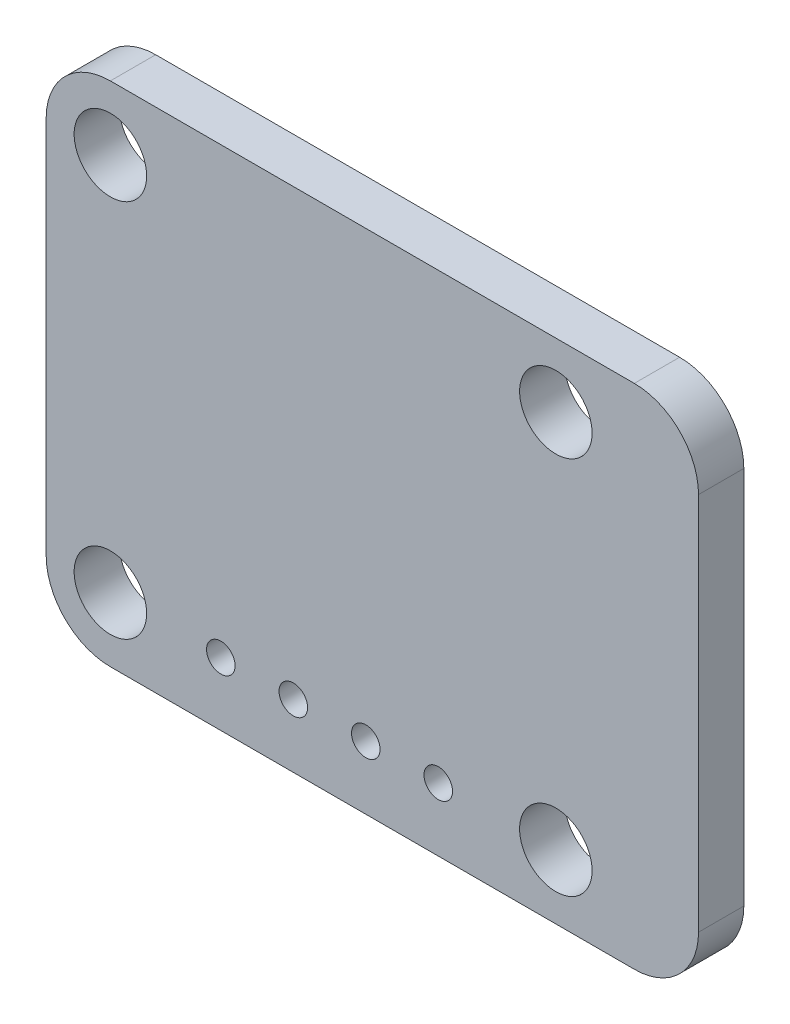
ISO-10303-21;
HEADER;
FILE_DESCRIPTION(('STEP AP214'),'2;1');
FILE_NAME('part.step','',(''),(''),'','','');
FILE_SCHEMA(('AUTOMOTIVE_DESIGN { 1 0 10303 214 1 1 1 1 }'));
ENDSEC;
DATA;
#1=APPLICATION_CONTEXT('core data for automotive mechanical design processes');
#2=APPLICATION_PROTOCOL_DEFINITION('international standard','automotive_design',2000,#1);
#3=PRODUCT_CONTEXT('',#1,'mechanical');
#4=PRODUCT('Part','Part','',(#3));
#5=PRODUCT_RELATED_PRODUCT_CATEGORY('part','',(#4));
#6=PRODUCT_DEFINITION_FORMATION('','',#4);
#7=PRODUCT_DEFINITION_CONTEXT('part definition',#1,'design');
#8=PRODUCT_DEFINITION('design','',#6,#7);
#9=PRODUCT_DEFINITION_SHAPE('','',#8);
#10=(LENGTH_UNIT() NAMED_UNIT(*) SI_UNIT(.MILLI.,.METRE.));
#11=(NAMED_UNIT(*) PLANE_ANGLE_UNIT() SI_UNIT($,.RADIAN.));
#12=(NAMED_UNIT(*) SI_UNIT($,.STERADIAN.) SOLID_ANGLE_UNIT());
#13=UNCERTAINTY_MEASURE_WITH_UNIT(LENGTH_MEASURE(1.E-05),#10,'distance_accuracy_value','');
#14=(GEOMETRIC_REPRESENTATION_CONTEXT(3) GLOBAL_UNCERTAINTY_ASSIGNED_CONTEXT((#13)) GLOBAL_UNIT_ASSIGNED_CONTEXT((#10,
#11,#12)) REPRESENTATION_CONTEXT('',''));
#15=CARTESIAN_POINT('',(0.,0.,0.));
#16=DIRECTION('',(0.,0.,1.));
#17=DIRECTION('',(1.,0.,0.));
#18=AXIS2_PLACEMENT_3D('',#15,#16,#17);
#19=CARTESIAN_POINT('',(-9.18,-6.64,1.5875));
#20=DIRECTION('',(0.,0.,-1.));
#21=DIRECTION('',(-1.,0.,0.));
#22=AXIS2_PLACEMENT_3D('',#19,#20,#21);
#23=CYLINDRICAL_SURFACE('',#22,2.25);
#24=CARTESIAN_POINT('',(-9.18,-6.64,0.));
#25=DIRECTION('',(0.,0.,1.));
#26=DIRECTION('',(-1.,0.,0.));
#27=AXIS2_PLACEMENT_3D('',#24,#25,#26);
#28=CIRCLE('',#27,2.25);
#29=CARTESIAN_POINT('',(-11.43,-6.64,0.));
#30=VERTEX_POINT('',#29);
#31=CARTESIAN_POINT('',(-9.18,-8.89,0.));
#32=VERTEX_POINT('',#31);
#33=EDGE_CURVE('E130',#30,#32,#28,.T.);
#34=ORIENTED_EDGE('',*,*,#33,.T.);
#35=DIRECTION('',(0.,0.,-1.));
#36=VECTOR('',#35,1.);
#37=CARTESIAN_POINT('',(-9.18,-8.89,1.5875));
#38=LINE('',#37,#36);
#39=CARTESIAN_POINT('',(-9.18,-8.89,1.5875));
#40=VERTEX_POINT('',#39);
#41=EDGE_CURVE('E11',#40,#32,#38,.T.);
#42=ORIENTED_EDGE('',*,*,#41,.F.);
#43=CARTESIAN_POINT('',(-9.18,-6.64,1.5875));
#44=DIRECTION('',(0.,0.,1.));
#45=DIRECTION('',(-1.,0.,0.));
#46=AXIS2_PLACEMENT_3D('',#43,#44,#45);
#47=CIRCLE('',#46,2.25);
#48=CARTESIAN_POINT('',(-11.43,-6.64,1.5875));
#49=VERTEX_POINT('',#48);
#50=EDGE_CURVE('E145',#49,#40,#47,.T.);
#51=ORIENTED_EDGE('',*,*,#50,.F.);
#52=DIRECTION('',(0.,0.,-1.));
#53=VECTOR('',#52,1.);
#54=CARTESIAN_POINT('',(-11.43,-6.64,1.5875));
#55=LINE('',#54,#53);
#56=EDGE_CURVE('E126',#49,#30,#55,.T.);
#57=ORIENTED_EDGE('',*,*,#56,.T.);
#58=EDGE_LOOP('',(#34,#42,#51,#57));
#59=FACE_BOUND('',#58,.T.);
#60=ADVANCED_FACE('F34',(#59),#23,.T.);
#61=CARTESIAN_POINT('',(9.18,-8.89,1.5875));
#62=DIRECTION('',(0.,1.,0.));
#63=DIRECTION('',(0.,0.,1.));
#64=AXIS2_PLACEMENT_3D('',#61,#62,#63);
#65=PLANE('',#64);
#66=DIRECTION('',(1.,0.,0.));
#67=VECTOR('',#66,1.);
#68=CARTESIAN_POINT('',(9.18,-8.89,0.));
#69=LINE('',#68,#67);
#70=CARTESIAN_POINT('',(9.18,-8.89,0.));
#71=VERTEX_POINT('',#70);
#72=EDGE_CURVE('E133',#32,#71,#69,.T.);
#73=ORIENTED_EDGE('',*,*,#72,.T.);
#74=DIRECTION('',(0.,0.,-1.));
#75=VECTOR('',#74,1.);
#76=CARTESIAN_POINT('',(9.18,-8.89,1.5875));
#77=LINE('',#76,#75);
#78=CARTESIAN_POINT('',(9.18,-8.89,1.5875));
#79=VERTEX_POINT('',#78);
#80=EDGE_CURVE('E42',#79,#71,#77,.T.);
#81=ORIENTED_EDGE('',*,*,#80,.F.);
#82=DIRECTION('',(1.,0.,0.));
#83=VECTOR('',#82,1.);
#84=CARTESIAN_POINT('',(9.18,-8.89,1.5875));
#85=LINE('',#84,#83);
#86=EDGE_CURVE('E93',#40,#79,#85,.T.);
#87=ORIENTED_EDGE('',*,*,#86,.F.);
#88=ORIENTED_EDGE('',*,*,#41,.T.);
#89=EDGE_LOOP('',(#73,#81,#87,#88));
#90=FACE_BOUND('',#89,.T.);
#91=ADVANCED_FACE('F263',(#90),#65,.F.);
#92=CARTESIAN_POINT('',(9.18,-6.64,1.5875));
#93=DIRECTION('',(0.,0.,-1.));
#94=DIRECTION('',(-1.,0.,0.));
#95=AXIS2_PLACEMENT_3D('',#92,#93,#94);
#96=CYLINDRICAL_SURFACE('',#95,2.25);
#97=CARTESIAN_POINT('',(9.18,-6.64,0.));
#98=DIRECTION('',(0.,0.,1.));
#99=DIRECTION('',(1.,0.,0.));
#100=AXIS2_PLACEMENT_3D('',#97,#98,#99);
#101=CIRCLE('',#100,2.25);
#102=CARTESIAN_POINT('',(11.43,-6.64,0.));
#103=VERTEX_POINT('',#102);
#104=EDGE_CURVE('E136',#71,#103,#101,.T.);
#105=ORIENTED_EDGE('',*,*,#104,.T.);
#106=DIRECTION('',(0.,0.,-1.));
#107=VECTOR('',#106,1.);
#108=CARTESIAN_POINT('',(11.43,-6.64,1.5875));
#109=LINE('',#108,#107);
#110=CARTESIAN_POINT('',(11.43,-6.64,1.5875));
#111=VERTEX_POINT('',#110);
#112=EDGE_CURVE('E152',#111,#103,#109,.T.);
#113=ORIENTED_EDGE('',*,*,#112,.F.);
#114=CARTESIAN_POINT('',(9.18,-6.64,1.5875));
#115=DIRECTION('',(0.,0.,1.));
#116=DIRECTION('',(1.,0.,0.));
#117=AXIS2_PLACEMENT_3D('',#114,#115,#116);
#118=CIRCLE('',#117,2.25);
#119=EDGE_CURVE('E160',#79,#111,#118,.T.);
#120=ORIENTED_EDGE('',*,*,#119,.F.);
#121=ORIENTED_EDGE('',*,*,#80,.T.);
#122=EDGE_LOOP('',(#105,#113,#120,#121));
#123=FACE_BOUND('',#122,.T.);
#124=ADVANCED_FACE('F158',(#123),#96,.T.);
#125=CARTESIAN_POINT('',(11.43,-6.64,1.5875));
#126=DIRECTION('',(-1.,0.,0.));
#127=DIRECTION('',(0.,0.,1.));
#128=AXIS2_PLACEMENT_3D('',#125,#126,#127);
#129=PLANE('',#128);
#130=DIRECTION('',(0.,1.,0.));
#131=VECTOR('',#130,1.);
#132=CARTESIAN_POINT('',(11.43,-6.64,0.));
#133=LINE('',#132,#131);
#134=CARTESIAN_POINT('',(11.43,6.64,0.));
#135=VERTEX_POINT('',#134);
#136=EDGE_CURVE('E138',#103,#135,#133,.T.);
#137=ORIENTED_EDGE('',*,*,#136,.T.);
#138=DIRECTION('',(0.,0.,-1.));
#139=VECTOR('',#138,1.);
#140=CARTESIAN_POINT('',(11.43,6.64,1.5875));
#141=LINE('',#140,#139);
#142=CARTESIAN_POINT('',(11.43,6.64,1.5875));
#143=VERTEX_POINT('',#142);
#144=EDGE_CURVE('E149',#143,#135,#141,.T.);
#145=ORIENTED_EDGE('',*,*,#144,.F.);
#146=DIRECTION('',(0.,1.,0.));
#147=VECTOR('',#146,1.);
#148=CARTESIAN_POINT('',(11.43,-6.64,1.5875));
#149=LINE('',#148,#147);
#150=EDGE_CURVE('E172',#111,#143,#149,.T.);
#151=ORIENTED_EDGE('',*,*,#150,.F.);
#152=ORIENTED_EDGE('',*,*,#112,.T.);
#153=EDGE_LOOP('',(#137,#145,#151,#152));
#154=FACE_BOUND('',#153,.T.);
#155=ADVANCED_FACE('F168',(#154),#129,.F.);
#156=CARTESIAN_POINT('',(9.18,6.64,1.5875));
#157=DIRECTION('',(0.,0.,-1.));
#158=DIRECTION('',(-1.,0.,0.));
#159=AXIS2_PLACEMENT_3D('',#156,#157,#158);
#160=CYLINDRICAL_SURFACE('',#159,2.25);
#161=CARTESIAN_POINT('',(9.18,6.64,0.));
#162=DIRECTION('',(0.,0.,1.));
#163=DIRECTION('',(1.,0.,0.));
#164=AXIS2_PLACEMENT_3D('',#161,#162,#163);
#165=CIRCLE('',#164,2.25);
#166=CARTESIAN_POINT('',(9.18,8.89,0.));
#167=VERTEX_POINT('',#166);
#168=EDGE_CURVE('E140',#135,#167,#165,.T.);
#169=ORIENTED_EDGE('',*,*,#168,.T.);
#170=DIRECTION('',(0.,0.,-1.));
#171=VECTOR('',#170,1.);
#172=CARTESIAN_POINT('',(9.18,8.89,1.5875));
#173=LINE('',#172,#171);
#174=CARTESIAN_POINT('',(9.18,8.89,1.5875));
#175=VERTEX_POINT('',#174);
#176=EDGE_CURVE('E121',#175,#167,#173,.T.);
#177=ORIENTED_EDGE('',*,*,#176,.F.);
#178=CARTESIAN_POINT('',(9.18,6.64,1.5875));
#179=DIRECTION('',(0.,0.,1.));
#180=DIRECTION('',(1.,0.,0.));
#181=AXIS2_PLACEMENT_3D('',#178,#179,#180);
#182=CIRCLE('',#181,2.25);
#183=EDGE_CURVE('E112',#143,#175,#182,.T.);
#184=ORIENTED_EDGE('',*,*,#183,.F.);
#185=ORIENTED_EDGE('',*,*,#144,.T.);
#186=EDGE_LOOP('',(#169,#177,#184,#185));
#187=FACE_BOUND('',#186,.T.);
#188=ADVANCED_FACE('F171',(#187),#160,.T.);
#189=CARTESIAN_POINT('',(9.18,8.89,1.5875));
#190=DIRECTION('',(0.,-1.,0.));
#191=DIRECTION('',(1.,0.,0.));
#192=AXIS2_PLACEMENT_3D('',#189,#190,#191);
#193=PLANE('',#192);
#194=DIRECTION('',(-1.,0.,0.));
#195=VECTOR('',#194,1.);
#196=CARTESIAN_POINT('',(9.18,8.89,0.));
#197=LINE('',#196,#195);
#198=CARTESIAN_POINT('',(-9.18,8.89,0.));
#199=VERTEX_POINT('',#198);
#200=EDGE_CURVE('E120',#167,#199,#197,.T.);
#201=ORIENTED_EDGE('',*,*,#200,.T.);
#202=DIRECTION('',(0.,0.,-1.));
#203=VECTOR('',#202,1.);
#204=CARTESIAN_POINT('',(-9.18,8.89,1.5875));
#205=LINE('',#204,#203);
#206=CARTESIAN_POINT('',(-9.18,8.89,1.5875));
#207=VERTEX_POINT('',#206);
#208=EDGE_CURVE('E117',#207,#199,#205,.T.);
#209=ORIENTED_EDGE('',*,*,#208,.F.);
#210=DIRECTION('',(-1.,0.,0.));
#211=VECTOR('',#210,1.);
#212=CARTESIAN_POINT('',(9.18,8.89,1.5875));
#213=LINE('',#212,#211);
#214=EDGE_CURVE('E106',#175,#207,#213,.T.);
#215=ORIENTED_EDGE('',*,*,#214,.F.);
#216=ORIENTED_EDGE('',*,*,#176,.T.);
#217=EDGE_LOOP('',(#201,#209,#215,#216));
#218=FACE_BOUND('',#217,.T.);
#219=ADVANCED_FACE('F118',(#218),#193,.F.);
#220=CARTESIAN_POINT('',(-9.18,6.64,1.5875));
#221=DIRECTION('',(0.,0.,-1.));
#222=DIRECTION('',(-1.,0.,0.));
#223=AXIS2_PLACEMENT_3D('',#220,#221,#222);
#224=CYLINDRICAL_SURFACE('',#223,2.25);
#225=CARTESIAN_POINT('',(-9.18,6.64,0.));
#226=DIRECTION('',(0.,0.,1.));
#227=DIRECTION('',(1.,0.,0.));
#228=AXIS2_PLACEMENT_3D('',#225,#226,#227);
#229=CIRCLE('',#228,2.25);
#230=CARTESIAN_POINT('',(-11.43,6.64,0.));
#231=VERTEX_POINT('',#230);
#232=EDGE_CURVE('E79',#199,#231,#229,.T.);
#233=ORIENTED_EDGE('',*,*,#232,.T.);
#234=DIRECTION('',(0.,0.,-1.));
#235=VECTOR('',#234,1.);
#236=CARTESIAN_POINT('',(-11.43,6.64,1.5875));
#237=LINE('',#236,#235);
#238=CARTESIAN_POINT('',(-11.43,6.64,1.5875));
#239=VERTEX_POINT('',#238);
#240=EDGE_CURVE('E122',#239,#231,#237,.T.);
#241=ORIENTED_EDGE('',*,*,#240,.F.);
#242=CARTESIAN_POINT('',(-9.18,6.64,1.5875));
#243=DIRECTION('',(0.,0.,1.));
#244=DIRECTION('',(1.,0.,0.));
#245=AXIS2_PLACEMENT_3D('',#242,#243,#244);
#246=CIRCLE('',#245,2.25);
#247=EDGE_CURVE('E110',#207,#239,#246,.T.);
#248=ORIENTED_EDGE('',*,*,#247,.F.);
#249=ORIENTED_EDGE('',*,*,#208,.T.);
#250=EDGE_LOOP('',(#233,#241,#248,#249));
#251=FACE_BOUND('',#250,.T.);
#252=ADVANCED_FACE('F124',(#251),#224,.T.);
#253=CARTESIAN_POINT('',(-11.43,-6.64,1.5875));
#254=DIRECTION('',(1.,0.,0.));
#255=DIRECTION('',(0.,1.,0.));
#256=AXIS2_PLACEMENT_3D('',#253,#254,#255);
#257=PLANE('',#256);
#258=DIRECTION('',(0.,-1.,0.));
#259=VECTOR('',#258,1.);
#260=CARTESIAN_POINT('',(-11.43,-6.64,0.));
#261=LINE('',#260,#259);
#262=EDGE_CURVE('E85',#231,#30,#261,.T.);
#263=ORIENTED_EDGE('',*,*,#262,.T.);
#264=ORIENTED_EDGE('',*,*,#56,.F.);
#265=DIRECTION('',(0.,-1.,0.));
#266=VECTOR('',#265,1.);
#267=CARTESIAN_POINT('',(-11.43,-6.64,1.5875));
#268=LINE('',#267,#266);
#269=EDGE_CURVE('E50',#239,#49,#268,.T.);
#270=ORIENTED_EDGE('',*,*,#269,.F.);
#271=ORIENTED_EDGE('',*,*,#240,.T.);
#272=EDGE_LOOP('',(#263,#264,#270,#271));
#273=FACE_BOUND('',#272,.T.);
#274=ADVANCED_FACE('F238',(#273),#257,.F.);
#275=CARTESIAN_POINT('',(-9.18,-6.64,1.5875));
#276=DIRECTION('',(0.,0.,-1.));
#277=DIRECTION('',(-1.,0.,0.));
#278=AXIS2_PLACEMENT_3D('',#275,#276,#277);
#279=PLANE('',#278);
#280=CARTESIAN_POINT('',(6.43,6.64,1.5875));
#281=DIRECTION('',(0.,0.,1.));
#282=DIRECTION('',(1.,0.,0.));
#283=AXIS2_PLACEMENT_3D('',#280,#281,#282);
#284=CIRCLE('',#283,1.27);
#285=CARTESIAN_POINT('',(7.69999999999999,6.64,1.5875));
#286=VERTEX_POINT('',#285);
#287=EDGE_CURVE('E203',#286,#286,#284,.T.);
#288=ORIENTED_EDGE('',*,*,#287,.F.);
#289=EDGE_LOOP('',(#288));
#290=FACE_BOUND('',#289,.T.);
#291=CARTESIAN_POINT('',(6.43,-6.64,1.5875));
#292=DIRECTION('',(0.,0.,1.));
#293=DIRECTION('',(1.,0.,0.));
#294=AXIS2_PLACEMENT_3D('',#291,#292,#293);
#295=CIRCLE('',#294,1.27);
#296=CARTESIAN_POINT('',(7.7,-6.64,1.5875));
#297=VERTEX_POINT('',#296);
#298=EDGE_CURVE('E197',#297,#297,#295,.T.);
#299=ORIENTED_EDGE('',*,*,#298,.F.);
#300=EDGE_LOOP('',(#299));
#301=FACE_BOUND('',#300,.T.);
#302=CARTESIAN_POINT('',(-9.18,-6.64,1.5875));
#303=DIRECTION('',(0.,0.,1.));
#304=DIRECTION('',(1.,0.,0.));
#305=AXIS2_PLACEMENT_3D('',#302,#303,#304);
#306=CIRCLE('',#305,1.27);
#307=CARTESIAN_POINT('',(-7.91,-6.64,1.5875));
#308=VERTEX_POINT('',#307);
#309=EDGE_CURVE('E191',#308,#308,#306,.T.);
#310=ORIENTED_EDGE('',*,*,#309,.F.);
#311=EDGE_LOOP('',(#310));
#312=FACE_BOUND('',#311,.T.);
#313=CARTESIAN_POINT('',(-5.30955950913352,-6.67516770766952,1.5875));
#314=DIRECTION('',(0.,0.,1.));
#315=DIRECTION('',(1.,0.,0.));
#316=AXIS2_PLACEMENT_3D('',#313,#314,#315);
#317=CIRCLE('',#316,0.500000000000001);
#318=CARTESIAN_POINT('',(-4.80955950913352,-6.67516770766952,1.5875));
#319=VERTEX_POINT('',#318);
#320=EDGE_CURVE('E184',#319,#319,#317,.T.);
#321=ORIENTED_EDGE('',*,*,#320,.F.);
#322=EDGE_LOOP('',(#321));
#323=FACE_BOUND('',#322,.T.);
#324=CARTESIAN_POINT('',(-2.76955950913352,-6.67516770766952,1.5875));
#325=DIRECTION('',(0.,0.,1.));
#326=DIRECTION('',(1.,0.,0.));
#327=AXIS2_PLACEMENT_3D('',#324,#325,#326);
#328=CIRCLE('',#327,0.5);
#329=CARTESIAN_POINT('',(-2.26955950913352,-6.67516770766952,1.5875));
#330=VERTEX_POINT('',#329);
#331=EDGE_CURVE('E220',#330,#330,#328,.T.);
#332=ORIENTED_EDGE('',*,*,#331,.F.);
#333=EDGE_LOOP('',(#332));
#334=FACE_BOUND('',#333,.T.);
#335=CARTESIAN_POINT('',(-0.229559509133516,-6.67516770766952,1.5875));
#336=DIRECTION('',(0.,0.,1.));
#337=DIRECTION('',(1.,0.,0.));
#338=AXIS2_PLACEMENT_3D('',#335,#336,#337);
#339=CIRCLE('',#338,0.5);
#340=CARTESIAN_POINT('',(0.270440490866484,-6.67516770766952,1.5875));
#341=VERTEX_POINT('',#340);
#342=EDGE_CURVE('E214',#341,#341,#339,.T.);
#343=ORIENTED_EDGE('',*,*,#342,.F.);
#344=EDGE_LOOP('',(#343));
#345=FACE_BOUND('',#344,.T.);
#346=CARTESIAN_POINT('',(2.31044049086648,-6.67516770766952,1.5875));
#347=DIRECTION('',(0.,0.,1.));
#348=DIRECTION('',(1.,0.,0.));
#349=AXIS2_PLACEMENT_3D('',#346,#347,#348);
#350=CIRCLE('',#349,0.500000000000001);
#351=CARTESIAN_POINT('',(2.81044049086648,-6.67516770766952,1.5875));
#352=VERTEX_POINT('',#351);
#353=EDGE_CURVE('E208',#352,#352,#350,.T.);
#354=ORIENTED_EDGE('',*,*,#353,.F.);
#355=EDGE_LOOP('',(#354));
#356=FACE_BOUND('',#355,.T.);
#357=CARTESIAN_POINT('',(-9.18,6.64,1.5875));
#358=DIRECTION('',(0.,0.,1.));
#359=DIRECTION('',(1.,0.,0.));
#360=AXIS2_PLACEMENT_3D('',#357,#358,#359);
#361=CIRCLE('',#360,1.27);
#362=CARTESIAN_POINT('',(-7.91,6.64,1.5875));
#363=VERTEX_POINT('',#362);
#364=EDGE_CURVE('E178',#363,#363,#361,.T.);
#365=ORIENTED_EDGE('',*,*,#364,.F.);
#366=EDGE_LOOP('',(#365));
#367=FACE_BOUND('',#366,.T.);
#368=ORIENTED_EDGE('',*,*,#50,.T.);
#369=ORIENTED_EDGE('',*,*,#86,.T.);
#370=ORIENTED_EDGE('',*,*,#119,.T.);
#371=ORIENTED_EDGE('',*,*,#150,.T.);
#372=ORIENTED_EDGE('',*,*,#183,.T.);
#373=ORIENTED_EDGE('',*,*,#214,.T.);
#374=ORIENTED_EDGE('',*,*,#247,.T.);
#375=ORIENTED_EDGE('',*,*,#269,.T.);
#376=EDGE_LOOP('',(#368,#369,#370,#371,#372,#373,#374,#375));
#377=FACE_BOUND('',#376,.T.);
#378=ADVANCED_FACE('F108',(#290,#301,#312,#323,#334,#345,#356,#367,#377),#279,.F.);
#379=CARTESIAN_POINT('',(-9.18,-6.64,0.));
#380=DIRECTION('',(0.,0.,-1.));
#381=DIRECTION('',(-1.,0.,0.));
#382=AXIS2_PLACEMENT_3D('',#379,#380,#381);
#383=PLANE('',#382);
#384=CARTESIAN_POINT('',(6.43,6.64,0.));
#385=DIRECTION('',(0.,0.,1.));
#386=DIRECTION('',(1.,0.,0.));
#387=AXIS2_PLACEMENT_3D('',#384,#385,#386);
#388=CIRCLE('',#387,1.27);
#389=CARTESIAN_POINT('',(7.69999999999999,6.64,0.));
#390=VERTEX_POINT('',#389);
#391=EDGE_CURVE('E181',#390,#390,#388,.T.);
#392=ORIENTED_EDGE('',*,*,#391,.T.);
#393=EDGE_LOOP('',(#392));
#394=FACE_BOUND('',#393,.T.);
#395=CARTESIAN_POINT('',(6.43,-6.64,0.));
#396=DIRECTION('',(0.,0.,1.));
#397=DIRECTION('',(1.,0.,0.));
#398=AXIS2_PLACEMENT_3D('',#395,#396,#397);
#399=CIRCLE('',#398,1.27);
#400=CARTESIAN_POINT('',(7.7,-6.64,0.));
#401=VERTEX_POINT('',#400);
#402=EDGE_CURVE('E200',#401,#401,#399,.T.);
#403=ORIENTED_EDGE('',*,*,#402,.T.);
#404=EDGE_LOOP('',(#403));
#405=FACE_BOUND('',#404,.T.);
#406=CARTESIAN_POINT('',(-9.18,-6.64,0.));
#407=DIRECTION('',(0.,0.,1.));
#408=DIRECTION('',(1.,0.,0.));
#409=AXIS2_PLACEMENT_3D('',#406,#407,#408);
#410=CIRCLE('',#409,1.27);
#411=CARTESIAN_POINT('',(-7.91,-6.64,0.));
#412=VERTEX_POINT('',#411);
#413=EDGE_CURVE('E194',#412,#412,#410,.T.);
#414=ORIENTED_EDGE('',*,*,#413,.T.);
#415=EDGE_LOOP('',(#414));
#416=FACE_BOUND('',#415,.T.);
#417=CARTESIAN_POINT('',(-5.30955950913352,-6.67516770766952,0.));
#418=DIRECTION('',(0.,0.,1.));
#419=DIRECTION('',(1.,0.,0.));
#420=AXIS2_PLACEMENT_3D('',#417,#418,#419);
#421=CIRCLE('',#420,0.500000000000001);
#422=CARTESIAN_POINT('',(-4.80955950913352,-6.67516770766952,0.));
#423=VERTEX_POINT('',#422);
#424=EDGE_CURVE('E187',#423,#423,#421,.T.);
#425=ORIENTED_EDGE('',*,*,#424,.T.);
#426=EDGE_LOOP('',(#425));
#427=FACE_BOUND('',#426,.T.);
#428=CARTESIAN_POINT('',(-2.76955950913352,-6.67516770766952,0.));
#429=DIRECTION('',(0.,0.,1.));
#430=DIRECTION('',(1.,0.,0.));
#431=AXIS2_PLACEMENT_3D('',#428,#429,#430);
#432=CIRCLE('',#431,0.5);
#433=CARTESIAN_POINT('',(-2.26955950913352,-6.67516770766952,0.));
#434=VERTEX_POINT('',#433);
#435=EDGE_CURVE('E188',#434,#434,#432,.T.);
#436=ORIENTED_EDGE('',*,*,#435,.T.);
#437=EDGE_LOOP('',(#436));
#438=FACE_BOUND('',#437,.T.);
#439=CARTESIAN_POINT('',(-0.229559509133516,-6.67516770766952,0.));
#440=DIRECTION('',(0.,0.,1.));
#441=DIRECTION('',(1.,0.,0.));
#442=AXIS2_PLACEMENT_3D('',#439,#440,#441);
#443=CIRCLE('',#442,0.5);
#444=CARTESIAN_POINT('',(0.270440490866484,-6.67516770766952,0.));
#445=VERTEX_POINT('',#444);
#446=EDGE_CURVE('E217',#445,#445,#443,.T.);
#447=ORIENTED_EDGE('',*,*,#446,.T.);
#448=EDGE_LOOP('',(#447));
#449=FACE_BOUND('',#448,.T.);
#450=CARTESIAN_POINT('',(2.31044049086648,-6.67516770766952,0.));
#451=DIRECTION('',(0.,0.,1.));
#452=DIRECTION('',(1.,0.,0.));
#453=AXIS2_PLACEMENT_3D('',#450,#451,#452);
#454=CIRCLE('',#453,0.500000000000001);
#455=CARTESIAN_POINT('',(2.81044049086648,-6.67516770766952,0.));
#456=VERTEX_POINT('',#455);
#457=EDGE_CURVE('E211',#456,#456,#454,.T.);
#458=ORIENTED_EDGE('',*,*,#457,.T.);
#459=EDGE_LOOP('',(#458));
#460=FACE_BOUND('',#459,.T.);
#461=CARTESIAN_POINT('',(-9.18,6.64,0.));
#462=DIRECTION('',(0.,0.,1.));
#463=DIRECTION('',(1.,0.,0.));
#464=AXIS2_PLACEMENT_3D('',#461,#462,#463);
#465=CIRCLE('',#464,1.27);
#466=CARTESIAN_POINT('',(-7.91,6.64,0.));
#467=VERTEX_POINT('',#466);
#468=EDGE_CURVE('E134',#467,#467,#465,.T.);
#469=ORIENTED_EDGE('',*,*,#468,.T.);
#470=EDGE_LOOP('',(#469));
#471=FACE_BOUND('',#470,.T.);
#472=ORIENTED_EDGE('',*,*,#33,.F.);
#473=ORIENTED_EDGE('',*,*,#262,.F.);
#474=ORIENTED_EDGE('',*,*,#232,.F.);
#475=ORIENTED_EDGE('',*,*,#200,.F.);
#476=ORIENTED_EDGE('',*,*,#168,.F.);
#477=ORIENTED_EDGE('',*,*,#136,.F.);
#478=ORIENTED_EDGE('',*,*,#104,.F.);
#479=ORIENTED_EDGE('',*,*,#72,.F.);
#480=EDGE_LOOP('',(#472,#473,#474,#475,#476,#477,#478,#479));
#481=FACE_BOUND('',#480,.T.);
#482=ADVANCED_FACE('F164',(#394,#405,#416,#427,#438,#449,#460,#471,#481),#383,.T.);
#483=CARTESIAN_POINT('',(-9.18,6.64,0.));
#484=DIRECTION('',(0.,0.,1.));
#485=DIRECTION('',(1.,0.,0.));
#486=AXIS2_PLACEMENT_3D('',#483,#484,#485);
#487=CYLINDRICAL_SURFACE('',#486,1.27);
#488=ORIENTED_EDGE('',*,*,#468,.F.);
#489=EDGE_LOOP('',(#488));
#490=FACE_BOUND('',#489,.T.);
#491=ORIENTED_EDGE('',*,*,#364,.T.);
#492=EDGE_LOOP('',(#491));
#493=FACE_BOUND('',#492,.T.);
#494=ADVANCED_FACE('F247',(#490,#493),#487,.F.);
#495=CARTESIAN_POINT('',(2.31044049086648,-6.67516770766952,0.));
#496=DIRECTION('',(0.,0.,1.));
#497=DIRECTION('',(1.,0.,0.));
#498=AXIS2_PLACEMENT_3D('',#495,#496,#497);
#499=CYLINDRICAL_SURFACE('',#498,0.500000000000001);
#500=ORIENTED_EDGE('',*,*,#457,.F.);
#501=EDGE_LOOP('',(#500));
#502=FACE_BOUND('',#501,.T.);
#503=ORIENTED_EDGE('',*,*,#353,.T.);
#504=EDGE_LOOP('',(#503));
#505=FACE_BOUND('',#504,.T.);
#506=ADVANCED_FACE('F249',(#502,#505),#499,.F.);
#507=CARTESIAN_POINT('',(-0.229559509133516,-6.67516770766952,0.));
#508=DIRECTION('',(0.,0.,1.));
#509=DIRECTION('',(1.,0.,0.));
#510=AXIS2_PLACEMENT_3D('',#507,#508,#509);
#511=CYLINDRICAL_SURFACE('',#510,0.5);
#512=ORIENTED_EDGE('',*,*,#446,.F.);
#513=EDGE_LOOP('',(#512));
#514=FACE_BOUND('',#513,.T.);
#515=ORIENTED_EDGE('',*,*,#342,.T.);
#516=EDGE_LOOP('',(#515));
#517=FACE_BOUND('',#516,.T.);
#518=ADVANCED_FACE('F232',(#514,#517),#511,.F.);
#519=CARTESIAN_POINT('',(-2.76955950913352,-6.67516770766952,0.));
#520=DIRECTION('',(0.,0.,1.));
#521=DIRECTION('',(1.,0.,0.));
#522=AXIS2_PLACEMENT_3D('',#519,#520,#521);
#523=CYLINDRICAL_SURFACE('',#522,0.5);
#524=ORIENTED_EDGE('',*,*,#435,.F.);
#525=EDGE_LOOP('',(#524));
#526=FACE_BOUND('',#525,.T.);
#527=ORIENTED_EDGE('',*,*,#331,.T.);
#528=EDGE_LOOP('',(#527));
#529=FACE_BOUND('',#528,.T.);
#530=ADVANCED_FACE('F228',(#526,#529),#523,.F.);
#531=CARTESIAN_POINT('',(-5.30955950913352,-6.67516770766952,0.));
#532=DIRECTION('',(0.,0.,1.));
#533=DIRECTION('',(1.,0.,0.));
#534=AXIS2_PLACEMENT_3D('',#531,#532,#533);
#535=CYLINDRICAL_SURFACE('',#534,0.500000000000001);
#536=ORIENTED_EDGE('',*,*,#424,.F.);
#537=EDGE_LOOP('',(#536));
#538=FACE_BOUND('',#537,.T.);
#539=ORIENTED_EDGE('',*,*,#320,.T.);
#540=EDGE_LOOP('',(#539));
#541=FACE_BOUND('',#540,.T.);
#542=ADVANCED_FACE('F231',(#538,#541),#535,.F.);
#543=CARTESIAN_POINT('',(-9.18,-6.64,0.));
#544=DIRECTION('',(0.,0.,1.));
#545=DIRECTION('',(1.,0.,0.));
#546=AXIS2_PLACEMENT_3D('',#543,#544,#545);
#547=CYLINDRICAL_SURFACE('',#546,1.27);
#548=ORIENTED_EDGE('',*,*,#413,.F.);
#549=EDGE_LOOP('',(#548));
#550=FACE_BOUND('',#549,.T.);
#551=ORIENTED_EDGE('',*,*,#309,.T.);
#552=EDGE_LOOP('',(#551));
#553=FACE_BOUND('',#552,.T.);
#554=ADVANCED_FACE('F357',(#550,#553),#547,.F.);
#555=CARTESIAN_POINT('',(6.43,-6.64,0.));
#556=DIRECTION('',(0.,0.,1.));
#557=DIRECTION('',(1.,0.,0.));
#558=AXIS2_PLACEMENT_3D('',#555,#556,#557);
#559=CYLINDRICAL_SURFACE('',#558,1.27);
#560=ORIENTED_EDGE('',*,*,#402,.F.);
#561=EDGE_LOOP('',(#560));
#562=FACE_BOUND('',#561,.T.);
#563=ORIENTED_EDGE('',*,*,#298,.T.);
#564=EDGE_LOOP('',(#563));
#565=FACE_BOUND('',#564,.T.);
#566=ADVANCED_FACE('F366',(#562,#565),#559,.F.);
#567=CARTESIAN_POINT('',(6.43,6.64,0.));
#568=DIRECTION('',(0.,0.,1.));
#569=DIRECTION('',(1.,0.,0.));
#570=AXIS2_PLACEMENT_3D('',#567,#568,#569);
#571=CYLINDRICAL_SURFACE('',#570,1.27);
#572=ORIENTED_EDGE('',*,*,#391,.F.);
#573=EDGE_LOOP('',(#572));
#574=FACE_BOUND('',#573,.T.);
#575=ORIENTED_EDGE('',*,*,#287,.T.);
#576=EDGE_LOOP('',(#575));
#577=FACE_BOUND('',#576,.T.);
#578=ADVANCED_FACE('F376',(#574,#577),#571,.F.);
#579=CLOSED_SHELL('',(#60,#91,#124,#155,#188,#219,#252,#274,#378,#482,#494,#506,#518,#530,#542,
#554,#566,#578));
#580=MANIFOLD_SOLID_BREP('B2',#579);
#581=ADVANCED_BREP_SHAPE_REPRESENTATION('',(#18,#580),#14);
#582=SHAPE_DEFINITION_REPRESENTATION(#9,#581);
ENDSEC;
END-ISO-10303-21;
